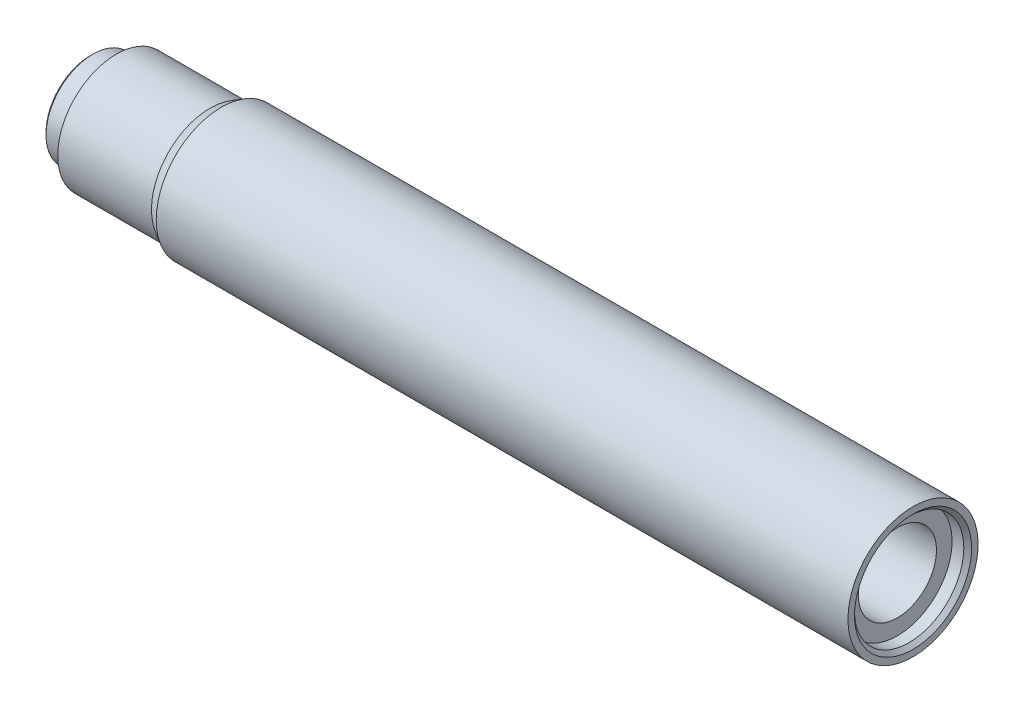
ISO-10303-21;
HEADER;
FILE_DESCRIPTION(('STEP AP214'),'2;1');
FILE_NAME('part.step','',(''),(''),'','','');
FILE_SCHEMA(('AUTOMOTIVE_DESIGN { 1 0 10303 214 1 1 1 1 }'));
ENDSEC;
DATA;
#1=APPLICATION_CONTEXT('core data for automotive mechanical design processes');
#2=APPLICATION_PROTOCOL_DEFINITION('international standard','automotive_design',2000,#1);
#3=PRODUCT_CONTEXT('',#1,'mechanical');
#4=PRODUCT('Part','Part','',(#3));
#5=PRODUCT_RELATED_PRODUCT_CATEGORY('part','',(#4));
#6=PRODUCT_DEFINITION_FORMATION('','',#4);
#7=PRODUCT_DEFINITION_CONTEXT('part definition',#1,'design');
#8=PRODUCT_DEFINITION('design','',#6,#7);
#9=PRODUCT_DEFINITION_SHAPE('','',#8);
#10=(LENGTH_UNIT() NAMED_UNIT(*) SI_UNIT(.MILLI.,.METRE.));
#11=(NAMED_UNIT(*) PLANE_ANGLE_UNIT() SI_UNIT($,.RADIAN.));
#12=(NAMED_UNIT(*) SI_UNIT($,.STERADIAN.) SOLID_ANGLE_UNIT());
#13=UNCERTAINTY_MEASURE_WITH_UNIT(LENGTH_MEASURE(1.E-05),#10,'distance_accuracy_value','');
#14=(GEOMETRIC_REPRESENTATION_CONTEXT(3) GLOBAL_UNCERTAINTY_ASSIGNED_CONTEXT((#13)) GLOBAL_UNIT_ASSIGNED_CONTEXT((#10,
#11,#12)) REPRESENTATION_CONTEXT('',''));
#15=CARTESIAN_POINT('',(0.,0.,0.));
#16=DIRECTION('',(0.,0.,1.));
#17=DIRECTION('',(1.,0.,0.));
#18=AXIS2_PLACEMENT_3D('',#15,#16,#17);
#19=CARTESIAN_POINT('',(63.2,-5.06,5.06));
#20=DIRECTION('',(1.,0.,0.));
#21=DIRECTION('',(0.,0.,-1.));
#22=AXIS2_PLACEMENT_3D('',#19,#20,#21);
#23=PLANE('',#22);
#24=CARTESIAN_POINT('',(63.2,0.,0.));
#25=DIRECTION('',(1.,0.,0.));
#26=DIRECTION('',(0.,0.,-1.));
#27=AXIS2_PLACEMENT_3D('',#24,#25,#26);
#28=CIRCLE('',#27,4.50000000000003);
#29=CARTESIAN_POINT('',(63.2,0.,-4.50000000000003));
#30=VERTEX_POINT('',#29);
#31=EDGE_CURVE('E19',#30,#30,#28,.T.);
#32=ORIENTED_EDGE('',*,*,#31,.F.);
#33=EDGE_LOOP('',(#32));
#34=FACE_BOUND('',#33,.T.);
#35=CARTESIAN_POINT('',(63.2,0.,0.));
#36=DIRECTION('',(-1.,0.,0.));
#37=DIRECTION('',(0.,0.,1.));
#38=AXIS2_PLACEMENT_3D('',#35,#36,#37);
#39=CIRCLE('',#38,5.);
#40=CARTESIAN_POINT('',(63.2,0.,5.));
#41=VERTEX_POINT('',#40);
#42=EDGE_CURVE('E47',#41,#41,#39,.F.);
#43=ORIENTED_EDGE('',*,*,#42,.T.);
#44=EDGE_LOOP('',(#43));
#45=FACE_BOUND('',#44,.T.);
#46=ADVANCED_FACE('F15',(#34,#45),#23,.T.);
#47=CARTESIAN_POINT('',(62.9,0.,0.));
#48=DIRECTION('',(1.,0.,0.));
#49=DIRECTION('',(0.,0.,-1.));
#50=AXIS2_PLACEMENT_3D('',#47,#48,#49);
#51=CONICAL_SURFACE('',#50,4.2,0.785398163397434);
#52=ORIENTED_EDGE('',*,*,#31,.T.);
#53=EDGE_LOOP('',(#52));
#54=FACE_BOUND('',#53,.T.);
#55=CARTESIAN_POINT('',(62.9,0.,0.));
#56=DIRECTION('',(-1.,0.,0.));
#57=DIRECTION('',(0.,0.,1.));
#58=AXIS2_PLACEMENT_3D('',#55,#56,#57);
#59=CIRCLE('',#58,4.2);
#60=CARTESIAN_POINT('',(62.9,0.,4.2));
#61=VERTEX_POINT('',#60);
#62=EDGE_CURVE('E44',#61,#61,#59,.F.);
#63=ORIENTED_EDGE('',*,*,#62,.F.);
#64=EDGE_LOOP('',(#63));
#65=FACE_BOUND('',#64,.T.);
#66=ADVANCED_FACE('F78',(#54,#65),#51,.F.);
#67=CARTESIAN_POINT('',(63.2,0.,0.));
#68=DIRECTION('',(-1.,0.,0.));
#69=DIRECTION('',(0.,0.,1.));
#70=AXIS2_PLACEMENT_3D('',#67,#68,#69);
#71=CYLINDRICAL_SURFACE('',#70,5.);
#72=ORIENTED_EDGE('',*,*,#42,.F.);
#73=EDGE_LOOP('',(#72));
#74=FACE_BOUND('',#73,.T.);
#75=CARTESIAN_POINT('',(10.066025404,0.,0.));
#76=DIRECTION('',(1.,0.,0.));
#77=DIRECTION('',(0.,0.,-1.));
#78=AXIS2_PLACEMENT_3D('',#75,#76,#77);
#79=CIRCLE('',#78,5.);
#80=CARTESIAN_POINT('',(10.066025404,0.,-5.));
#81=VERTEX_POINT('',#80);
#82=EDGE_CURVE('E41',#81,#81,#79,.T.);
#83=ORIENTED_EDGE('',*,*,#82,.T.);
#84=EDGE_LOOP('',(#83));
#85=FACE_BOUND('',#84,.T.);
#86=ADVANCED_FACE('F87',(#74,#85),#71,.T.);
#87=CARTESIAN_POINT('',(62.9,0.,0.));
#88=DIRECTION('',(-1.,0.,0.));
#89=DIRECTION('',(0.,0.,1.));
#90=AXIS2_PLACEMENT_3D('',#87,#88,#89);
#91=CYLINDRICAL_SURFACE('',#90,4.2);
#92=CARTESIAN_POINT('',(62.,0.,0.));
#93=DIRECTION('',(-1.,0.,0.));
#94=DIRECTION('',(0.,0.,1.));
#95=AXIS2_PLACEMENT_3D('',#92,#93,#94);
#96=CIRCLE('',#95,4.2);
#97=CARTESIAN_POINT('',(62.,0.,4.2));
#98=VERTEX_POINT('',#97);
#99=EDGE_CURVE('E40',#98,#98,#96,.F.);
#100=ORIENTED_EDGE('',*,*,#99,.F.);
#101=EDGE_LOOP('',(#100));
#102=FACE_BOUND('',#101,.T.);
#103=ORIENTED_EDGE('',*,*,#62,.T.);
#104=EDGE_LOOP('',(#103));
#105=FACE_BOUND('',#104,.T.);
#106=ADVANCED_FACE('F132',(#102,#105),#91,.F.);
#107=CARTESIAN_POINT('',(9.2,0.,0.));
#108=DIRECTION('',(1.,0.,0.));
#109=DIRECTION('',(0.,0.,-1.));
#110=AXIS2_PLACEMENT_3D('',#107,#108,#109);
#111=CONICAL_SURFACE('',#110,4.5,0.523598775490518);
#112=CARTESIAN_POINT('',(9.2,0.,0.));
#113=DIRECTION('',(-1.,0.,0.));
#114=DIRECTION('',(0.,0.,1.));
#115=AXIS2_PLACEMENT_3D('',#112,#113,#114);
#116=CIRCLE('',#115,4.5);
#117=CARTESIAN_POINT('',(9.2,0.,4.5));
#118=VERTEX_POINT('',#117);
#119=EDGE_CURVE('E36',#118,#118,#116,.F.);
#120=ORIENTED_EDGE('',*,*,#119,.T.);
#121=EDGE_LOOP('',(#120));
#122=FACE_BOUND('',#121,.T.);
#123=ORIENTED_EDGE('',*,*,#82,.F.);
#124=EDGE_LOOP('',(#123));
#125=FACE_BOUND('',#124,.T.);
#126=ADVANCED_FACE('F129',(#122,#125),#111,.T.);
#127=CARTESIAN_POINT('',(62.,-4.2504,4.2504));
#128=DIRECTION('',(1.,0.,0.));
#129=DIRECTION('',(0.,0.,-1.));
#130=AXIS2_PLACEMENT_3D('',#127,#128,#129);
#131=PLANE('',#130);
#132=CARTESIAN_POINT('',(62.,0.,0.));
#133=DIRECTION('',(-1.,0.,0.));
#134=DIRECTION('',(0.,0.,1.));
#135=AXIS2_PLACEMENT_3D('',#132,#133,#134);
#136=CIRCLE('',#135,3.);
#137=CARTESIAN_POINT('',(62.,0.,3.));
#138=VERTEX_POINT('',#137);
#139=EDGE_CURVE('E39',#138,#138,#136,.F.);
#140=ORIENTED_EDGE('',*,*,#139,.F.);
#141=EDGE_LOOP('',(#140));
#142=FACE_BOUND('',#141,.T.);
#143=ORIENTED_EDGE('',*,*,#99,.T.);
#144=EDGE_LOOP('',(#143));
#145=FACE_BOUND('',#144,.T.);
#146=ADVANCED_FACE('F127',(#142,#145),#131,.T.);
#147=CARTESIAN_POINT('',(9.2,0.,0.));
#148=DIRECTION('',(-1.,0.,0.));
#149=DIRECTION('',(0.,0.,1.));
#150=AXIS2_PLACEMENT_3D('',#147,#148,#149);
#151=CYLINDRICAL_SURFACE('',#150,4.5);
#152=ORIENTED_EDGE('',*,*,#119,.F.);
#153=EDGE_LOOP('',(#152));
#154=FACE_BOUND('',#153,.T.);
#155=CARTESIAN_POINT('',(2.,0.,0.));
#156=DIRECTION('',(-1.,0.,0.));
#157=DIRECTION('',(0.,0.,1.));
#158=AXIS2_PLACEMENT_3D('',#155,#156,#157);
#159=CIRCLE('',#158,4.5);
#160=CARTESIAN_POINT('',(2.,0.,4.5));
#161=VERTEX_POINT('',#160);
#162=EDGE_CURVE('E66',#161,#161,#159,.T.);
#163=ORIENTED_EDGE('',*,*,#162,.F.);
#164=EDGE_LOOP('',(#163));
#165=FACE_BOUND('',#164,.T.);
#166=ADVANCED_FACE('F123',(#154,#165),#151,.T.);
#167=CARTESIAN_POINT('',(62.,0.,0.));
#168=DIRECTION('',(-1.,0.,0.));
#169=DIRECTION('',(0.,0.,1.));
#170=AXIS2_PLACEMENT_3D('',#167,#168,#169);
#171=CYLINDRICAL_SURFACE('',#170,3.);
#172=CARTESIAN_POINT('',(53.45,0.,0.));
#173=DIRECTION('',(-1.,0.,0.));
#174=DIRECTION('',(0.,0.,1.));
#175=AXIS2_PLACEMENT_3D('',#172,#173,#174);
#176=CIRCLE('',#175,3.);
#177=CARTESIAN_POINT('',(53.45,0.,3.));
#178=VERTEX_POINT('',#177);
#179=EDGE_CURVE('E63',#178,#178,#176,.F.);
#180=ORIENTED_EDGE('',*,*,#179,.F.);
#181=EDGE_LOOP('',(#180));
#182=FACE_BOUND('',#181,.T.);
#183=ORIENTED_EDGE('',*,*,#139,.T.);
#184=EDGE_LOOP('',(#183));
#185=FACE_BOUND('',#184,.T.);
#186=ADVANCED_FACE('F119',(#182,#185),#171,.F.);
#187=CARTESIAN_POINT('',(2.,-4.554,-4.554));
#188=DIRECTION('',(-1.,0.,0.));
#189=DIRECTION('',(0.,0.,1.));
#190=AXIS2_PLACEMENT_3D('',#187,#188,#189);
#191=PLANE('',#190);
#192=CARTESIAN_POINT('',(2.,0.,0.));
#193=DIRECTION('',(-1.,0.,0.));
#194=DIRECTION('',(0.,0.,1.));
#195=AXIS2_PLACEMENT_3D('',#192,#193,#194);
#196=CIRCLE('',#195,3.6);
#197=CARTESIAN_POINT('',(2.,0.,3.6));
#198=VERTEX_POINT('',#197);
#199=EDGE_CURVE('E60',#198,#198,#196,.F.);
#200=ORIENTED_EDGE('',*,*,#199,.T.);
#201=EDGE_LOOP('',(#200));
#202=FACE_BOUND('',#201,.T.);
#203=ORIENTED_EDGE('',*,*,#162,.T.);
#204=EDGE_LOOP('',(#203));
#205=FACE_BOUND('',#204,.T.);
#206=ADVANCED_FACE('F122',(#202,#205),#191,.T.);
#207=CARTESIAN_POINT('',(53.45,-3.1119,-3.1119));
#208=DIRECTION('',(-1.,0.,0.));
#209=DIRECTION('',(0.,0.,1.));
#210=AXIS2_PLACEMENT_3D('',#207,#208,#209);
#211=PLANE('',#210);
#212=ORIENTED_EDGE('',*,*,#179,.T.);
#213=EDGE_LOOP('',(#212));
#214=FACE_BOUND('',#213,.T.);
#215=CARTESIAN_POINT('',(53.45,0.,0.));
#216=DIRECTION('',(-1.,0.,0.));
#217=DIRECTION('',(0.,0.,1.));
#218=AXIS2_PLACEMENT_3D('',#215,#216,#217);
#219=CIRCLE('',#218,3.075);
#220=CARTESIAN_POINT('',(53.45,0.,3.075));
#221=VERTEX_POINT('',#220);
#222=EDGE_CURVE('E35',#221,#221,#219,.F.);
#223=ORIENTED_EDGE('',*,*,#222,.F.);
#224=EDGE_LOOP('',(#223));
#225=FACE_BOUND('',#224,.T.);
#226=ADVANCED_FACE('F117',(#214,#225),#211,.T.);
#227=CARTESIAN_POINT('',(2.,0.,0.));
#228=DIRECTION('',(-1.,0.,0.));
#229=DIRECTION('',(0.,0.,1.));
#230=AXIS2_PLACEMENT_3D('',#227,#228,#229);
#231=CYLINDRICAL_SURFACE('',#230,3.6);
#232=CARTESIAN_POINT('',(0.199999999999978,0.,0.));
#233=DIRECTION('',(1.,0.,0.));
#234=DIRECTION('',(0.,0.,-1.));
#235=AXIS2_PLACEMENT_3D('',#232,#233,#234);
#236=CIRCLE('',#235,3.6);
#237=CARTESIAN_POINT('',(0.2,0.,-3.6));
#238=VERTEX_POINT('',#237);
#239=EDGE_CURVE('E31',#238,#238,#236,.T.);
#240=ORIENTED_EDGE('',*,*,#239,.T.);
#241=EDGE_LOOP('',(#240));
#242=FACE_BOUND('',#241,.T.);
#243=ORIENTED_EDGE('',*,*,#199,.F.);
#244=EDGE_LOOP('',(#243));
#245=FACE_BOUND('',#244,.T.);
#246=ADVANCED_FACE('F113',(#242,#245),#231,.T.);
#247=CARTESIAN_POINT('',(53.45,0.,0.));
#248=DIRECTION('',(-1.,0.,0.));
#249=DIRECTION('',(0.,0.,1.));
#250=AXIS2_PLACEMENT_3D('',#247,#248,#249);
#251=CYLINDRICAL_SURFACE('',#250,3.075);
#252=CARTESIAN_POINT('',(43.95,0.,0.));
#253=DIRECTION('',(-1.,0.,0.));
#254=DIRECTION('',(0.,0.,1.));
#255=AXIS2_PLACEMENT_3D('',#252,#253,#254);
#256=CIRCLE('',#255,3.075);
#257=CARTESIAN_POINT('',(43.95,0.,3.075));
#258=VERTEX_POINT('',#257);
#259=EDGE_CURVE('E34',#258,#258,#256,.F.);
#260=ORIENTED_EDGE('',*,*,#259,.F.);
#261=EDGE_LOOP('',(#260));
#262=FACE_BOUND('',#261,.T.);
#263=ORIENTED_EDGE('',*,*,#222,.T.);
#264=EDGE_LOOP('',(#263));
#265=FACE_BOUND('',#264,.T.);
#266=ADVANCED_FACE('F109',(#262,#265),#251,.F.);
#267=CARTESIAN_POINT('',(0.,0.,0.));
#268=DIRECTION('',(1.,0.,0.));
#269=DIRECTION('',(0.,0.,-1.));
#270=AXIS2_PLACEMENT_3D('',#267,#268,#269);
#271=CONICAL_SURFACE('',#270,3.4,0.78539816339745);
#272=ORIENTED_EDGE('',*,*,#239,.F.);
#273=EDGE_LOOP('',(#272));
#274=FACE_BOUND('',#273,.T.);
#275=CARTESIAN_POINT('',(0.,0.,0.));
#276=DIRECTION('',(1.,0.,0.));
#277=DIRECTION('',(0.,0.,-1.));
#278=AXIS2_PLACEMENT_3D('',#275,#276,#277);
#279=CIRCLE('',#278,3.4);
#280=CARTESIAN_POINT('',(0.,0.,-3.4));
#281=VERTEX_POINT('',#280);
#282=EDGE_CURVE('E53',#281,#281,#279,.F.);
#283=ORIENTED_EDGE('',*,*,#282,.F.);
#284=EDGE_LOOP('',(#283));
#285=FACE_BOUND('',#284,.T.);
#286=ADVANCED_FACE('F105',(#274,#285),#271,.T.);
#287=CARTESIAN_POINT('',(43.95,-3.1119,3.1119));
#288=DIRECTION('',(1.,0.,0.));
#289=DIRECTION('',(0.,0.,-1.));
#290=AXIS2_PLACEMENT_3D('',#287,#288,#289);
#291=PLANE('',#290);
#292=CARTESIAN_POINT('',(43.95,0.,0.));
#293=DIRECTION('',(1.,0.,0.));
#294=DIRECTION('',(0.,0.,-1.));
#295=AXIS2_PLACEMENT_3D('',#292,#293,#294);
#296=CIRCLE('',#295,3.00000000000009);
#297=CARTESIAN_POINT('',(43.95,0.,-3.00000000000009));
#298=VERTEX_POINT('',#297);
#299=EDGE_CURVE('E50',#298,#298,#296,.T.);
#300=ORIENTED_EDGE('',*,*,#299,.F.);
#301=EDGE_LOOP('',(#300));
#302=FACE_BOUND('',#301,.T.);
#303=ORIENTED_EDGE('',*,*,#259,.T.);
#304=EDGE_LOOP('',(#303));
#305=FACE_BOUND('',#304,.T.);
#306=ADVANCED_FACE('F108',(#302,#305),#291,.T.);
#307=CARTESIAN_POINT('',(0.,-3.4408,-3.4408));
#308=DIRECTION('',(-1.,0.,0.));
#309=DIRECTION('',(0.,0.,1.));
#310=AXIS2_PLACEMENT_3D('',#307,#308,#309);
#311=PLANE('',#310);
#312=CARTESIAN_POINT('',(0.,0.,0.));
#313=DIRECTION('',(-1.,0.,0.));
#314=DIRECTION('',(0.,0.,1.));
#315=AXIS2_PLACEMENT_3D('',#312,#313,#314);
#316=CIRCLE('',#315,2.2);
#317=CARTESIAN_POINT('',(0.,0.,2.2));
#318=VERTEX_POINT('',#317);
#319=EDGE_CURVE('E28',#318,#318,#316,.T.);
#320=ORIENTED_EDGE('',*,*,#319,.F.);
#321=EDGE_LOOP('',(#320));
#322=FACE_BOUND('',#321,.T.);
#323=ORIENTED_EDGE('',*,*,#282,.T.);
#324=EDGE_LOOP('',(#323));
#325=FACE_BOUND('',#324,.T.);
#326=ADVANCED_FACE('F17',(#322,#325),#311,.T.);
#327=CARTESIAN_POINT('',(43.372649731,0.,0.));
#328=DIRECTION('',(1.,0.,0.));
#329=DIRECTION('',(0.,0.,-1.));
#330=AXIS2_PLACEMENT_3D('',#327,#328,#329);
#331=CONICAL_SURFACE('',#330,2.,1.04719755133882);
#332=ORIENTED_EDGE('',*,*,#299,.T.);
#333=EDGE_LOOP('',(#332));
#334=FACE_BOUND('',#333,.T.);
#335=CARTESIAN_POINT('',(43.372649731,0.,0.));
#336=DIRECTION('',(-1.,0.,0.));
#337=DIRECTION('',(0.,0.,1.));
#338=AXIS2_PLACEMENT_3D('',#335,#336,#337);
#339=CIRCLE('',#338,2.);
#340=CARTESIAN_POINT('',(43.372649731,0.,2.));
#341=VERTEX_POINT('',#340);
#342=EDGE_CURVE('E23',#341,#341,#339,.F.);
#343=ORIENTED_EDGE('',*,*,#342,.F.);
#344=EDGE_LOOP('',(#343));
#345=FACE_BOUND('',#344,.T.);
#346=ADVANCED_FACE('F97',(#334,#345),#331,.F.);
#347=CARTESIAN_POINT('',(0.2,0.,0.));
#348=DIRECTION('',(-1.,0.,0.));
#349=DIRECTION('',(0.,0.,1.));
#350=AXIS2_PLACEMENT_3D('',#347,#348,#349);
#351=CONICAL_SURFACE('',#350,2.,0.785398163397449);
#352=ORIENTED_EDGE('',*,*,#319,.T.);
#353=EDGE_LOOP('',(#352));
#354=FACE_BOUND('',#353,.T.);
#355=CARTESIAN_POINT('',(0.2,0.,0.));
#356=DIRECTION('',(-1.,0.,0.));
#357=DIRECTION('',(0.,0.,1.));
#358=AXIS2_PLACEMENT_3D('',#355,#356,#357);
#359=CIRCLE('',#358,2.);
#360=CARTESIAN_POINT('',(0.2,0.,2.));
#361=VERTEX_POINT('',#360);
#362=EDGE_CURVE('E10',#361,#361,#359,.T.);
#363=ORIENTED_EDGE('',*,*,#362,.F.);
#364=EDGE_LOOP('',(#363));
#365=FACE_BOUND('',#364,.T.);
#366=ADVANCED_FACE('F92',(#354,#365),#351,.F.);
#367=CARTESIAN_POINT('',(43.372649731,0.,0.));
#368=DIRECTION('',(-1.,0.,0.));
#369=DIRECTION('',(0.,0.,1.));
#370=AXIS2_PLACEMENT_3D('',#367,#368,#369);
#371=CYLINDRICAL_SURFACE('',#370,2.);
#372=ORIENTED_EDGE('',*,*,#362,.T.);
#373=EDGE_LOOP('',(#372));
#374=FACE_BOUND('',#373,.T.);
#375=ORIENTED_EDGE('',*,*,#342,.T.);
#376=EDGE_LOOP('',(#375));
#377=FACE_BOUND('',#376,.T.);
#378=ADVANCED_FACE('F90',(#374,#377),#371,.F.);
#379=CLOSED_SHELL('',(#46,#66,#86,#106,#126,#146,#166,#186,#206,#226,#246,#266,#286,#306,#326,
#346,#366,#378));
#380=MANIFOLD_SOLID_BREP('B1',#379);
#381=ADVANCED_BREP_SHAPE_REPRESENTATION('',(#18,#380),#14);
#382=SHAPE_DEFINITION_REPRESENTATION(#9,#381);
ENDSEC;
END-ISO-10303-21;
